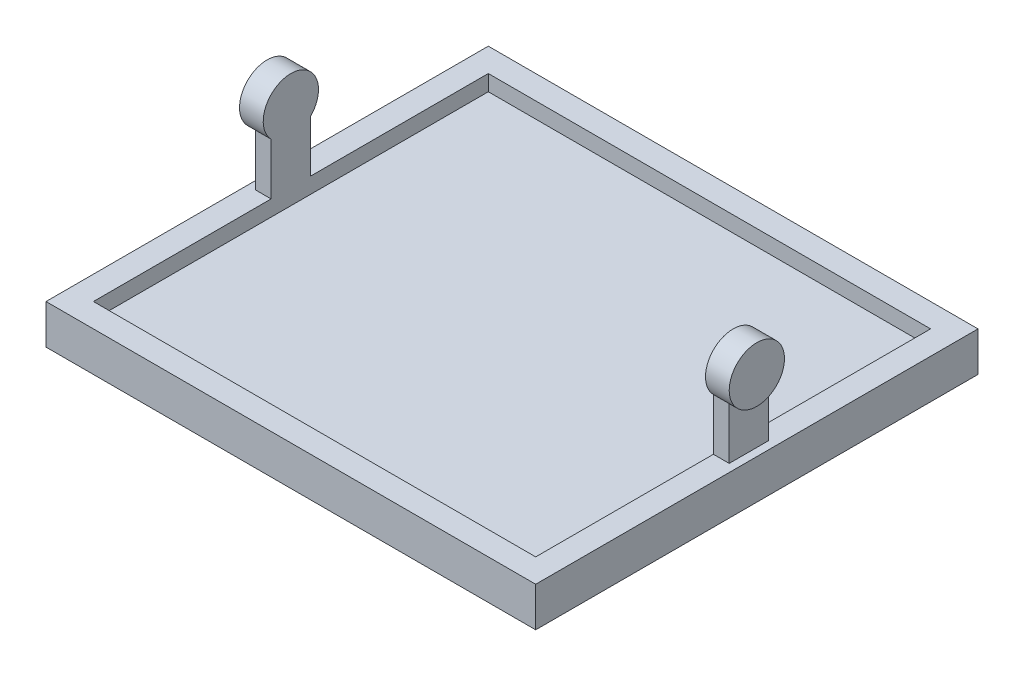
ISO-10303-21;
HEADER;
FILE_DESCRIPTION(('STEP AP214'),'2;1');
FILE_NAME('part.step','',(''),(''),'','','');
FILE_SCHEMA(('AUTOMOTIVE_DESIGN { 1 0 10303 214 1 1 1 1 }'));
ENDSEC;
DATA;
#1=APPLICATION_CONTEXT('core data for automotive mechanical design processes');
#2=APPLICATION_PROTOCOL_DEFINITION('international standard','automotive_design',2000,#1);
#3=PRODUCT_CONTEXT('',#1,'mechanical');
#4=PRODUCT('Part','Part','',(#3));
#5=PRODUCT_RELATED_PRODUCT_CATEGORY('part','',(#4));
#6=PRODUCT_DEFINITION_FORMATION('','',#4);
#7=PRODUCT_DEFINITION_CONTEXT('part definition',#1,'design');
#8=PRODUCT_DEFINITION('design','',#6,#7);
#9=PRODUCT_DEFINITION_SHAPE('','',#8);
#10=(LENGTH_UNIT() NAMED_UNIT(*) SI_UNIT(.MILLI.,.METRE.));
#11=(NAMED_UNIT(*) PLANE_ANGLE_UNIT() SI_UNIT($,.RADIAN.));
#12=(NAMED_UNIT(*) SI_UNIT($,.STERADIAN.) SOLID_ANGLE_UNIT());
#13=UNCERTAINTY_MEASURE_WITH_UNIT(LENGTH_MEASURE(1.E-05),#10,'distance_accuracy_value','');
#14=(GEOMETRIC_REPRESENTATION_CONTEXT(3) GLOBAL_UNCERTAINTY_ASSIGNED_CONTEXT((#13)) GLOBAL_UNIT_ASSIGNED_CONTEXT((#10,
#11,#12)) REPRESENTATION_CONTEXT('',''));
#15=CARTESIAN_POINT('',(0.,0.,0.));
#16=DIRECTION('',(0.,0.,1.));
#17=DIRECTION('',(1.,0.,0.));
#18=AXIS2_PLACEMENT_3D('',#15,#16,#17);
#19=CARTESIAN_POINT('',(0.,6.35,0.));
#20=DIRECTION('',(0.,1.,0.));
#21=DIRECTION('',(0.,0.,1.));
#22=AXIS2_PLACEMENT_3D('',#19,#20,#21);
#23=PLANE('',#22);
#24=DIRECTION('',(0.,0.,-1.));
#25=VECTOR('',#24,1.);
#26=CARTESIAN_POINT('',(39.37,6.35,-35.56));
#27=LINE('',#26,#25);
#28=CARTESIAN_POINT('',(39.37,6.35,35.56));
#29=VERTEX_POINT('',#28);
#30=CARTESIAN_POINT('',(39.37,6.35,-35.56));
#31=VERTEX_POINT('',#30);
#32=EDGE_CURVE('E239',#29,#31,#27,.T.);
#33=ORIENTED_EDGE('',*,*,#32,.T.);
#34=DIRECTION('',(-1.,0.,0.));
#35=VECTOR('',#34,1.);
#36=CARTESIAN_POINT('',(-39.37,6.35,-35.56));
#37=LINE('',#36,#35);
#38=CARTESIAN_POINT('',(-39.37,6.35,-35.56));
#39=VERTEX_POINT('',#38);
#40=EDGE_CURVE('E243',#31,#39,#37,.T.);
#41=ORIENTED_EDGE('',*,*,#40,.T.);
#42=DIRECTION('',(0.,0.,1.));
#43=VECTOR('',#42,1.);
#44=CARTESIAN_POINT('',(-39.37,6.35,-35.56));
#45=LINE('',#44,#43);
#46=CARTESIAN_POINT('',(-39.37,6.35,35.56));
#47=VERTEX_POINT('',#46);
#48=EDGE_CURVE('E247',#39,#47,#45,.T.);
#49=ORIENTED_EDGE('',*,*,#48,.T.);
#50=DIRECTION('',(1.,0.,0.));
#51=VECTOR('',#50,1.);
#52=CARTESIAN_POINT('',(-39.37,6.35,35.56));
#53=LINE('',#52,#51);
#54=EDGE_CURVE('E250',#47,#29,#53,.T.);
#55=ORIENTED_EDGE('',*,*,#54,.T.);
#56=EDGE_LOOP('',(#33,#41,#49,#55));
#57=FACE_BOUND('',#56,.T.);
#58=DIRECTION('',(0.,0.,-1.));
#59=VECTOR('',#58,1.);
#60=CARTESIAN_POINT('',(35.56,6.35,-31.75));
#61=LINE('',#60,#59);
#62=CARTESIAN_POINT('',(35.56,6.35,-3.175));
#63=VERTEX_POINT('',#62);
#64=CARTESIAN_POINT('',(35.56,6.35,-31.75));
#65=VERTEX_POINT('',#64);
#66=EDGE_CURVE('E170',#63,#65,#61,.T.);
#67=ORIENTED_EDGE('',*,*,#66,.F.);
#68=DIRECTION('',(-1.,0.,0.));
#69=VECTOR('',#68,1.);
#70=CARTESIAN_POINT('',(35.56,6.35,-3.175));
#71=LINE('',#70,#69);
#72=CARTESIAN_POINT('',(38.1,6.35,-3.175));
#73=VERTEX_POINT('',#72);
#74=EDGE_CURVE('E151',#73,#63,#71,.T.);
#75=ORIENTED_EDGE('',*,*,#74,.F.);
#76=DIRECTION('',(0.,0.,-1.));
#77=VECTOR('',#76,1.);
#78=CARTESIAN_POINT('',(38.1,6.35,-3.175));
#79=LINE('',#78,#77);
#80=CARTESIAN_POINT('',(38.1,6.35,3.175));
#81=VERTEX_POINT('',#80);
#82=EDGE_CURVE('E159',#81,#73,#79,.T.);
#83=ORIENTED_EDGE('',*,*,#82,.F.);
#84=DIRECTION('',(1.,0.,0.));
#85=VECTOR('',#84,1.);
#86=CARTESIAN_POINT('',(35.56,6.35,3.175));
#87=LINE('',#86,#85);
#88=CARTESIAN_POINT('',(35.56,6.35,3.175));
#89=VERTEX_POINT('',#88);
#90=EDGE_CURVE('E172',#89,#81,#87,.T.);
#91=ORIENTED_EDGE('',*,*,#90,.F.);
#92=CARTESIAN_POINT('',(35.56,6.35,31.75));
#93=VERTEX_POINT('',#92);
#94=EDGE_CURVE('E208',#93,#89,#61,.T.);
#95=ORIENTED_EDGE('',*,*,#94,.F.);
#96=DIRECTION('',(1.,0.,0.));
#97=VECTOR('',#96,1.);
#98=CARTESIAN_POINT('',(-35.56,6.35,31.75));
#99=LINE('',#98,#97);
#100=CARTESIAN_POINT('',(-35.56,6.35,31.75));
#101=VERTEX_POINT('',#100);
#102=EDGE_CURVE('E220',#101,#93,#99,.T.);
#103=ORIENTED_EDGE('',*,*,#102,.F.);
#104=DIRECTION('',(0.,0.,1.));
#105=VECTOR('',#104,1.);
#106=CARTESIAN_POINT('',(-35.56,6.35,-31.75));
#107=LINE('',#106,#105);
#108=CARTESIAN_POINT('',(-35.56,6.35,3.175));
#109=VERTEX_POINT('',#108);
#110=EDGE_CURVE('E215',#109,#101,#107,.T.);
#111=ORIENTED_EDGE('',*,*,#110,.F.);
#112=DIRECTION('',(1.,0.,0.));
#113=VECTOR('',#112,1.);
#114=CARTESIAN_POINT('',(-38.1,6.35,3.17499999999999));
#115=LINE('',#114,#113);
#116=CARTESIAN_POINT('',(-38.1,6.35,3.17499999999999));
#117=VERTEX_POINT('',#116);
#118=EDGE_CURVE('E192',#117,#109,#115,.T.);
#119=ORIENTED_EDGE('',*,*,#118,.F.);
#120=DIRECTION('',(0.,0.,1.));
#121=VECTOR('',#120,1.);
#122=CARTESIAN_POINT('',(-38.1,6.35,-3.17500000000001));
#123=LINE('',#122,#121);
#124=CARTESIAN_POINT('',(-38.1,6.35,-3.17500000000001));
#125=VERTEX_POINT('',#124);
#126=EDGE_CURVE('E188',#125,#117,#123,.T.);
#127=ORIENTED_EDGE('',*,*,#126,.F.);
#128=DIRECTION('',(-1.,0.,0.));
#129=VECTOR('',#128,1.);
#130=CARTESIAN_POINT('',(-38.1,6.35,-3.17500000000001));
#131=LINE('',#130,#129);
#132=CARTESIAN_POINT('',(-35.56,6.35,-3.175));
#133=VERTEX_POINT('',#132);
#134=EDGE_CURVE('E156',#133,#125,#131,.T.);
#135=ORIENTED_EDGE('',*,*,#134,.F.);
#136=CARTESIAN_POINT('',(-35.56,6.35,-31.75));
#137=VERTEX_POINT('',#136);
#138=EDGE_CURVE('E216',#137,#133,#107,.T.);
#139=ORIENTED_EDGE('',*,*,#138,.F.);
#140=DIRECTION('',(-1.,0.,0.));
#141=VECTOR('',#140,1.);
#142=CARTESIAN_POINT('',(-35.56,6.35,-31.75));
#143=LINE('',#142,#141);
#144=EDGE_CURVE('E212',#65,#137,#143,.T.);
#145=ORIENTED_EDGE('',*,*,#144,.F.);
#146=EDGE_LOOP('',(#67,#75,#83,#91,#95,#103,#111,#119,#127,#135,#139,#145));
#147=FACE_BOUND('',#146,.T.);
#148=ADVANCED_FACE('F39',(#57,#147),#23,.T.);
#149=CARTESIAN_POINT('',(0.,3.81,0.));
#150=DIRECTION('',(0.,-1.,0.));
#151=DIRECTION('',(0.,0.,-1.));
#152=AXIS2_PLACEMENT_3D('',#149,#150,#151);
#153=PLANE('',#152);
#154=DIRECTION('',(1.,0.,0.));
#155=VECTOR('',#154,1.);
#156=CARTESIAN_POINT('',(-35.56,3.81,31.75));
#157=LINE('',#156,#155);
#158=CARTESIAN_POINT('',(-35.56,3.81,31.75));
#159=VERTEX_POINT('',#158);
#160=CARTESIAN_POINT('',(35.56,3.81,31.75));
#161=VERTEX_POINT('',#160);
#162=EDGE_CURVE('E280',#159,#161,#157,.T.);
#163=ORIENTED_EDGE('',*,*,#162,.T.);
#164=DIRECTION('',(0.,0.,1.));
#165=VECTOR('',#164,1.);
#166=CARTESIAN_POINT('',(35.56,3.81,-31.75));
#167=LINE('',#166,#165);
#168=CARTESIAN_POINT('',(35.56,3.81,-31.75));
#169=VERTEX_POINT('',#168);
#170=EDGE_CURVE('E284',#169,#161,#167,.T.);
#171=ORIENTED_EDGE('',*,*,#170,.F.);
#172=DIRECTION('',(1.,0.,0.));
#173=VECTOR('',#172,1.);
#174=CARTESIAN_POINT('',(-35.56,3.81,-31.75));
#175=LINE('',#174,#173);
#176=CARTESIAN_POINT('',(-35.56,3.81,-31.75));
#177=VERTEX_POINT('',#176);
#178=EDGE_CURVE('E288',#177,#169,#175,.T.);
#179=ORIENTED_EDGE('',*,*,#178,.F.);
#180=DIRECTION('',(0.,0.,1.));
#181=VECTOR('',#180,1.);
#182=CARTESIAN_POINT('',(-35.56,3.81,-31.75));
#183=LINE('',#182,#181);
#184=EDGE_CURVE('E291',#177,#159,#183,.T.);
#185=ORIENTED_EDGE('',*,*,#184,.T.);
#186=EDGE_LOOP('',(#163,#171,#179,#185));
#187=FACE_BOUND('',#186,.T.);
#188=ADVANCED_FACE('F348',(#187),#153,.F.);
#189=CARTESIAN_POINT('',(35.56,6.35,-31.75));
#190=DIRECTION('',(-1.,0.,0.));
#191=DIRECTION('',(0.,0.,1.));
#192=AXIS2_PLACEMENT_3D('',#189,#190,#191);
#193=PLANE('',#192);
#194=DIRECTION('',(0.,-1.,0.));
#195=VECTOR('',#194,1.);
#196=CARTESIAN_POINT('',(35.56,17.78,3.175));
#197=LINE('',#196,#195);
#198=CARTESIAN_POINT('',(35.56,14.6691480266654,3.175));
#199=VERTEX_POINT('',#198);
#200=EDGE_CURVE('E180',#199,#89,#197,.T.);
#201=ORIENTED_EDGE('',*,*,#200,.F.);
#202=CARTESIAN_POINT('',(35.56,17.78,0.));
#203=DIRECTION('',(-1.,0.,0.));
#204=DIRECTION('',(0.,0.,1.));
#205=AXIS2_PLACEMENT_3D('',#202,#203,#204);
#206=CIRCLE('',#205,4.445);
#207=CARTESIAN_POINT('',(35.56,14.6691480266654,-3.175));
#208=VERTEX_POINT('',#207);
#209=EDGE_CURVE('E328',#199,#208,#206,.T.);
#210=ORIENTED_EDGE('',*,*,#209,.T.);
#211=DIRECTION('',(0.,-1.,0.));
#212=VECTOR('',#211,1.);
#213=CARTESIAN_POINT('',(35.56,17.78,-3.175));
#214=LINE('',#213,#212);
#215=EDGE_CURVE('E60',#208,#63,#214,.T.);
#216=ORIENTED_EDGE('',*,*,#215,.T.);
#217=ORIENTED_EDGE('',*,*,#66,.T.);
#218=DIRECTION('',(0.,-1.,0.));
#219=VECTOR('',#218,1.);
#220=CARTESIAN_POINT('',(35.56,6.35,-31.75));
#221=LINE('',#220,#219);
#222=EDGE_CURVE('E234',#65,#169,#221,.T.);
#223=ORIENTED_EDGE('',*,*,#222,.T.);
#224=ORIENTED_EDGE('',*,*,#170,.T.);
#225=DIRECTION('',(0.,-1.,0.));
#226=VECTOR('',#225,1.);
#227=CARTESIAN_POINT('',(35.56,6.35,31.75));
#228=LINE('',#227,#226);
#229=EDGE_CURVE('E223',#93,#161,#228,.T.);
#230=ORIENTED_EDGE('',*,*,#229,.F.);
#231=ORIENTED_EDGE('',*,*,#94,.T.);
#232=EDGE_LOOP('',(#201,#210,#216,#217,#223,#224,#230,#231));
#233=FACE_BOUND('',#232,.T.);
#234=ADVANCED_FACE('F356',(#233),#193,.T.);
#235=CARTESIAN_POINT('',(-35.56,6.35,-31.75));
#236=DIRECTION('',(0.,0.,1.));
#237=DIRECTION('',(1.,0.,0.));
#238=AXIS2_PLACEMENT_3D('',#235,#236,#237);
#239=PLANE('',#238);
#240=ORIENTED_EDGE('',*,*,#178,.T.);
#241=ORIENTED_EDGE('',*,*,#222,.F.);
#242=ORIENTED_EDGE('',*,*,#144,.T.);
#243=DIRECTION('',(0.,-1.,0.));
#244=VECTOR('',#243,1.);
#245=CARTESIAN_POINT('',(-35.56,6.35,-31.75));
#246=LINE('',#245,#244);
#247=EDGE_CURVE('E230',#137,#177,#246,.T.);
#248=ORIENTED_EDGE('',*,*,#247,.T.);
#249=EDGE_LOOP('',(#240,#241,#242,#248));
#250=FACE_BOUND('',#249,.T.);
#251=ADVANCED_FACE('F408',(#250),#239,.T.);
#252=CARTESIAN_POINT('',(-35.56,6.35,-31.75));
#253=DIRECTION('',(1.,0.,0.));
#254=DIRECTION('',(0.,0.,-1.));
#255=AXIS2_PLACEMENT_3D('',#252,#253,#254);
#256=PLANE('',#255);
#257=DIRECTION('',(0.,-1.,0.));
#258=VECTOR('',#257,1.);
#259=CARTESIAN_POINT('',(-35.56,17.78,-3.17500000000001));
#260=LINE('',#259,#258);
#261=CARTESIAN_POINT('',(-35.56,14.6691480266654,-3.17500000000001));
#262=VERTEX_POINT('',#261);
#263=EDGE_CURVE('E205',#262,#133,#260,.T.);
#264=ORIENTED_EDGE('',*,*,#263,.F.);
#265=CARTESIAN_POINT('',(-35.56,17.78,0.));
#266=DIRECTION('',(1.,0.,0.));
#267=DIRECTION('',(0.,0.,-1.));
#268=AXIS2_PLACEMENT_3D('',#265,#266,#267);
#269=CIRCLE('',#268,4.445);
#270=CARTESIAN_POINT('',(-35.56,14.6691480266654,3.17499999999999));
#271=VERTEX_POINT('',#270);
#272=EDGE_CURVE('E317',#262,#271,#269,.T.);
#273=ORIENTED_EDGE('',*,*,#272,.T.);
#274=DIRECTION('',(0.,-1.,0.));
#275=VECTOR('',#274,1.);
#276=CARTESIAN_POINT('',(-35.56,17.78,3.17499999999999));
#277=LINE('',#276,#275);
#278=EDGE_CURVE('E196',#271,#109,#277,.T.);
#279=ORIENTED_EDGE('',*,*,#278,.T.);
#280=ORIENTED_EDGE('',*,*,#110,.T.);
#281=DIRECTION('',(0.,-1.,0.));
#282=VECTOR('',#281,1.);
#283=CARTESIAN_POINT('',(-35.56,6.35,31.75));
#284=LINE('',#283,#282);
#285=EDGE_CURVE('E226',#101,#159,#284,.T.);
#286=ORIENTED_EDGE('',*,*,#285,.T.);
#287=ORIENTED_EDGE('',*,*,#184,.F.);
#288=ORIENTED_EDGE('',*,*,#247,.F.);
#289=ORIENTED_EDGE('',*,*,#138,.T.);
#290=EDGE_LOOP('',(#264,#273,#279,#280,#286,#287,#288,#289));
#291=FACE_BOUND('',#290,.T.);
#292=ADVANCED_FACE('F380',(#291),#256,.T.);
#293=CARTESIAN_POINT('',(-35.56,6.35,31.75));
#294=DIRECTION('',(0.,0.,-1.));
#295=DIRECTION('',(-1.,0.,0.));
#296=AXIS2_PLACEMENT_3D('',#293,#294,#295);
#297=PLANE('',#296);
#298=ORIENTED_EDGE('',*,*,#162,.F.);
#299=ORIENTED_EDGE('',*,*,#285,.F.);
#300=ORIENTED_EDGE('',*,*,#102,.T.);
#301=ORIENTED_EDGE('',*,*,#229,.T.);
#302=EDGE_LOOP('',(#298,#299,#300,#301));
#303=FACE_BOUND('',#302,.T.);
#304=ADVANCED_FACE('F375',(#303),#297,.T.);
#305=CARTESIAN_POINT('',(39.37,6.35,-35.56));
#306=DIRECTION('',(-1.,0.,0.));
#307=DIRECTION('',(0.,0.,1.));
#308=AXIS2_PLACEMENT_3D('',#305,#306,#307);
#309=PLANE('',#308);
#310=DIRECTION('',(0.,0.,-1.));
#311=VECTOR('',#310,1.);
#312=CARTESIAN_POINT('',(39.37,0.,-35.56));
#313=LINE('',#312,#311);
#314=CARTESIAN_POINT('',(39.37,0.,35.56));
#315=VERTEX_POINT('',#314);
#316=CARTESIAN_POINT('',(39.37,0.,-35.56));
#317=VERTEX_POINT('',#316);
#318=EDGE_CURVE('E238',#315,#317,#313,.T.);
#319=ORIENTED_EDGE('',*,*,#318,.T.);
#320=DIRECTION('',(0.,-1.,0.));
#321=VECTOR('',#320,1.);
#322=CARTESIAN_POINT('',(39.37,6.35,-35.56));
#323=LINE('',#322,#321);
#324=EDGE_CURVE('E276',#31,#317,#323,.T.);
#325=ORIENTED_EDGE('',*,*,#324,.F.);
#326=ORIENTED_EDGE('',*,*,#32,.F.);
#327=DIRECTION('',(0.,-1.,0.));
#328=VECTOR('',#327,1.);
#329=CARTESIAN_POINT('',(39.37,6.35,35.56));
#330=LINE('',#329,#328);
#331=EDGE_CURVE('E253',#29,#315,#330,.T.);
#332=ORIENTED_EDGE('',*,*,#331,.T.);
#333=EDGE_LOOP('',(#319,#325,#326,#332));
#334=FACE_BOUND('',#333,.T.);
#335=ADVANCED_FACE('F372',(#334),#309,.F.);
#336=CARTESIAN_POINT('',(-39.37,6.35,-35.56));
#337=DIRECTION('',(0.,0.,1.));
#338=DIRECTION('',(1.,0.,0.));
#339=AXIS2_PLACEMENT_3D('',#336,#337,#338);
#340=PLANE('',#339);
#341=DIRECTION('',(-1.,0.,0.));
#342=VECTOR('',#341,1.);
#343=CARTESIAN_POINT('',(-39.37,0.,-35.56));
#344=LINE('',#343,#342);
#345=CARTESIAN_POINT('',(-39.37,0.,-35.56));
#346=VERTEX_POINT('',#345);
#347=EDGE_CURVE('E257',#317,#346,#344,.T.);
#348=ORIENTED_EDGE('',*,*,#347,.T.);
#349=DIRECTION('',(0.,-1.,0.));
#350=VECTOR('',#349,1.);
#351=CARTESIAN_POINT('',(-39.37,6.35,-35.56));
#352=LINE('',#351,#350);
#353=EDGE_CURVE('E272',#39,#346,#352,.T.);
#354=ORIENTED_EDGE('',*,*,#353,.F.);
#355=ORIENTED_EDGE('',*,*,#40,.F.);
#356=ORIENTED_EDGE('',*,*,#324,.T.);
#357=EDGE_LOOP('',(#348,#354,#355,#356));
#358=FACE_BOUND('',#357,.T.);
#359=ADVANCED_FACE('F368',(#358),#340,.F.);
#360=CARTESIAN_POINT('',(-39.37,6.35,-35.56));
#361=DIRECTION('',(1.,0.,0.));
#362=DIRECTION('',(0.,0.,-1.));
#363=AXIS2_PLACEMENT_3D('',#360,#361,#362);
#364=PLANE('',#363);
#365=DIRECTION('',(0.,0.,1.));
#366=VECTOR('',#365,1.);
#367=CARTESIAN_POINT('',(-39.37,0.,-35.56));
#368=LINE('',#367,#366);
#369=CARTESIAN_POINT('',(-39.37,0.,35.56));
#370=VERTEX_POINT('',#369);
#371=EDGE_CURVE('E260',#346,#370,#368,.T.);
#372=ORIENTED_EDGE('',*,*,#371,.T.);
#373=DIRECTION('',(0.,-1.,0.));
#374=VECTOR('',#373,1.);
#375=CARTESIAN_POINT('',(-39.37,6.35,35.56));
#376=LINE('',#375,#374);
#377=EDGE_CURVE('E268',#47,#370,#376,.T.);
#378=ORIENTED_EDGE('',*,*,#377,.F.);
#379=ORIENTED_EDGE('',*,*,#48,.F.);
#380=ORIENTED_EDGE('',*,*,#353,.T.);
#381=EDGE_LOOP('',(#372,#378,#379,#380));
#382=FACE_BOUND('',#381,.T.);
#383=ADVANCED_FACE('F364',(#382),#364,.F.);
#384=CARTESIAN_POINT('',(-39.37,6.35,35.56));
#385=DIRECTION('',(0.,0.,-1.));
#386=DIRECTION('',(-1.,0.,0.));
#387=AXIS2_PLACEMENT_3D('',#384,#385,#386);
#388=PLANE('',#387);
#389=DIRECTION('',(1.,0.,0.));
#390=VECTOR('',#389,1.);
#391=CARTESIAN_POINT('',(-39.37,0.,35.56));
#392=LINE('',#391,#390);
#393=EDGE_CURVE('E244',#370,#315,#392,.T.);
#394=ORIENTED_EDGE('',*,*,#393,.T.);
#395=ORIENTED_EDGE('',*,*,#331,.F.);
#396=ORIENTED_EDGE('',*,*,#54,.F.);
#397=ORIENTED_EDGE('',*,*,#377,.T.);
#398=EDGE_LOOP('',(#394,#395,#396,#397));
#399=FACE_BOUND('',#398,.T.);
#400=ADVANCED_FACE('F361',(#399),#388,.F.);
#401=CARTESIAN_POINT('',(0.,0.,0.));
#402=DIRECTION('',(0.,-1.,0.));
#403=DIRECTION('',(0.,0.,-1.));
#404=AXIS2_PLACEMENT_3D('',#401,#402,#403);
#405=PLANE('',#404);
#406=ORIENTED_EDGE('',*,*,#318,.F.);
#407=ORIENTED_EDGE('',*,*,#393,.F.);
#408=ORIENTED_EDGE('',*,*,#371,.F.);
#409=ORIENTED_EDGE('',*,*,#347,.F.);
#410=EDGE_LOOP('',(#406,#407,#408,#409));
#411=FACE_BOUND('',#410,.T.);
#412=ADVANCED_FACE('F41',(#411),#405,.T.);
#413=CARTESIAN_POINT('',(-38.1,17.78,-3.17500000000001));
#414=DIRECTION('',(0.,0.,1.));
#415=DIRECTION('',(1.,0.,0.));
#416=AXIS2_PLACEMENT_3D('',#413,#414,#415);
#417=PLANE('',#416);
#418=DIRECTION('',(0.,-1.,0.));
#419=VECTOR('',#418,1.);
#420=CARTESIAN_POINT('',(-38.1,17.78,-3.17500000000001));
#421=LINE('',#420,#419);
#422=CARTESIAN_POINT('',(-38.1,14.6691480266654,-3.17500000000001));
#423=VERTEX_POINT('',#422);
#424=EDGE_CURVE('E202',#423,#125,#421,.T.);
#425=ORIENTED_EDGE('',*,*,#424,.F.);
#426=DIRECTION('',(1.,0.,0.));
#427=VECTOR('',#426,1.);
#428=CARTESIAN_POINT('',(-39.37,14.6691480266654,-3.17500000000001));
#429=LINE('',#428,#427);
#430=EDGE_CURVE('E167',#423,#262,#429,.T.);
#431=ORIENTED_EDGE('',*,*,#430,.T.);
#432=ORIENTED_EDGE('',*,*,#263,.T.);
#433=ORIENTED_EDGE('',*,*,#134,.T.);
#434=EDGE_LOOP('',(#425,#431,#432,#433));
#435=FACE_BOUND('',#434,.T.);
#436=ADVANCED_FACE('F395',(#435),#417,.F.);
#437=CARTESIAN_POINT('',(-38.1,17.78,-3.17500000000001));
#438=DIRECTION('',(1.,0.,0.));
#439=DIRECTION('',(0.,0.,-1.));
#440=AXIS2_PLACEMENT_3D('',#437,#438,#439);
#441=PLANE('',#440);
#442=DIRECTION('',(0.,-1.,0.));
#443=VECTOR('',#442,1.);
#444=CARTESIAN_POINT('',(-38.1,17.78,3.17499999999999));
#445=LINE('',#444,#443);
#446=CARTESIAN_POINT('',(-38.1,14.6691480266654,3.17499999999999));
#447=VERTEX_POINT('',#446);
#448=EDGE_CURVE('E199',#447,#117,#445,.T.);
#449=ORIENTED_EDGE('',*,*,#448,.F.);
#450=CARTESIAN_POINT('',(-38.1,17.78,0.));
#451=DIRECTION('',(1.,0.,0.));
#452=DIRECTION('',(0.,0.,-1.));
#453=AXIS2_PLACEMENT_3D('',#450,#451,#452);
#454=CIRCLE('',#453,4.445);
#455=EDGE_CURVE('E306',#447,#423,#454,.T.);
#456=ORIENTED_EDGE('',*,*,#455,.T.);
#457=ORIENTED_EDGE('',*,*,#424,.T.);
#458=ORIENTED_EDGE('',*,*,#126,.T.);
#459=EDGE_LOOP('',(#449,#456,#457,#458));
#460=FACE_BOUND('',#459,.T.);
#461=ADVANCED_FACE('F305',(#460),#441,.F.);
#462=CARTESIAN_POINT('',(-38.1,17.78,3.17499999999999));
#463=DIRECTION('',(0.,0.,-1.));
#464=DIRECTION('',(-1.,0.,0.));
#465=AXIS2_PLACEMENT_3D('',#462,#463,#464);
#466=PLANE('',#465);
#467=ORIENTED_EDGE('',*,*,#278,.F.);
#468=DIRECTION('',(1.,0.,0.));
#469=VECTOR('',#468,1.);
#470=CARTESIAN_POINT('',(-39.37,14.6691480266654,3.17499999999999));
#471=LINE('',#470,#469);
#472=EDGE_CURVE('E48',#271,#447,#471,.F.);
#473=ORIENTED_EDGE('',*,*,#472,.T.);
#474=ORIENTED_EDGE('',*,*,#448,.T.);
#475=ORIENTED_EDGE('',*,*,#118,.T.);
#476=EDGE_LOOP('',(#467,#473,#474,#475));
#477=FACE_BOUND('',#476,.T.);
#478=ADVANCED_FACE('F298',(#477),#466,.F.);
#479=CARTESIAN_POINT('',(38.1,17.78,-3.175));
#480=DIRECTION('',(-1.,0.,0.));
#481=DIRECTION('',(0.,0.,1.));
#482=AXIS2_PLACEMENT_3D('',#479,#480,#481);
#483=PLANE('',#482);
#484=DIRECTION('',(0.,-1.,0.));
#485=VECTOR('',#484,1.);
#486=CARTESIAN_POINT('',(38.1,17.78,-3.175));
#487=LINE('',#486,#485);
#488=CARTESIAN_POINT('',(38.1,14.6691480266654,-3.175));
#489=VERTEX_POINT('',#488);
#490=EDGE_CURVE('E147',#489,#73,#487,.T.);
#491=ORIENTED_EDGE('',*,*,#490,.F.);
#492=CARTESIAN_POINT('',(38.1,17.78,0.));
#493=DIRECTION('',(-1.,0.,0.));
#494=DIRECTION('',(0.,0.,1.));
#495=AXIS2_PLACEMENT_3D('',#492,#493,#494);
#496=CIRCLE('',#495,4.445);
#497=CARTESIAN_POINT('',(38.1,14.6691480266654,3.175));
#498=VERTEX_POINT('',#497);
#499=EDGE_CURVE('E324',#489,#498,#496,.T.);
#500=ORIENTED_EDGE('',*,*,#499,.T.);
#501=DIRECTION('',(0.,-1.,0.));
#502=VECTOR('',#501,1.);
#503=CARTESIAN_POINT('',(38.1,17.78,3.175));
#504=LINE('',#503,#502);
#505=EDGE_CURVE('E162',#498,#81,#504,.T.);
#506=ORIENTED_EDGE('',*,*,#505,.T.);
#507=ORIENTED_EDGE('',*,*,#82,.T.);
#508=EDGE_LOOP('',(#491,#500,#506,#507));
#509=FACE_BOUND('',#508,.T.);
#510=ADVANCED_FACE('F160',(#509),#483,.F.);
#511=CARTESIAN_POINT('',(35.56,17.78,-3.175));
#512=DIRECTION('',(0.,0.,1.));
#513=DIRECTION('',(1.,0.,0.));
#514=AXIS2_PLACEMENT_3D('',#511,#512,#513);
#515=PLANE('',#514);
#516=ORIENTED_EDGE('',*,*,#215,.F.);
#517=DIRECTION('',(-1.,0.,0.));
#518=VECTOR('',#517,1.);
#519=CARTESIAN_POINT('',(39.37,14.6691480266654,-3.175));
#520=LINE('',#519,#518);
#521=EDGE_CURVE('E55',#208,#489,#520,.F.);
#522=ORIENTED_EDGE('',*,*,#521,.T.);
#523=ORIENTED_EDGE('',*,*,#490,.T.);
#524=ORIENTED_EDGE('',*,*,#74,.T.);
#525=EDGE_LOOP('',(#516,#522,#523,#524));
#526=FACE_BOUND('',#525,.T.);
#527=ADVANCED_FACE('F149',(#526),#515,.F.);
#528=CARTESIAN_POINT('',(35.56,17.78,3.175));
#529=DIRECTION('',(0.,0.,-1.));
#530=DIRECTION('',(-1.,0.,0.));
#531=AXIS2_PLACEMENT_3D('',#528,#529,#530);
#532=PLANE('',#531);
#533=ORIENTED_EDGE('',*,*,#505,.F.);
#534=DIRECTION('',(-1.,0.,0.));
#535=VECTOR('',#534,1.);
#536=CARTESIAN_POINT('',(39.37,14.6691480266654,3.175));
#537=LINE('',#536,#535);
#538=EDGE_CURVE('E11',#498,#199,#537,.T.);
#539=ORIENTED_EDGE('',*,*,#538,.T.);
#540=ORIENTED_EDGE('',*,*,#200,.T.);
#541=ORIENTED_EDGE('',*,*,#90,.T.);
#542=EDGE_LOOP('',(#533,#539,#540,#541));
#543=FACE_BOUND('',#542,.T.);
#544=ADVANCED_FACE('F432',(#543),#532,.F.);
#545=CARTESIAN_POINT('',(-39.37,17.78,0.));
#546=DIRECTION('',(1.,0.,0.));
#547=DIRECTION('',(0.,0.,-1.));
#548=AXIS2_PLACEMENT_3D('',#545,#546,#547);
#549=CYLINDRICAL_SURFACE('',#548,4.445);
#550=CARTESIAN_POINT('',(-39.37,17.78,0.));
#551=DIRECTION('',(1.,0.,0.));
#552=DIRECTION('',(0.,0.,-1.));
#553=AXIS2_PLACEMENT_3D('',#550,#551,#552);
#554=CIRCLE('',#553,4.445);
#555=CARTESIAN_POINT('',(-39.37,17.78,-4.445));
#556=VERTEX_POINT('',#555);
#557=EDGE_CURVE('E312',#556,#556,#554,.T.);
#558=ORIENTED_EDGE('',*,*,#557,.T.);
#559=EDGE_LOOP('',(#558));
#560=FACE_BOUND('',#559,.T.);
#561=ORIENTED_EDGE('',*,*,#430,.F.);
#562=ORIENTED_EDGE('',*,*,#455,.F.);
#563=ORIENTED_EDGE('',*,*,#472,.F.);
#564=ORIENTED_EDGE('',*,*,#272,.F.);
#565=EDGE_LOOP('',(#561,#562,#563,#564));
#566=FACE_BOUND('',#565,.T.);
#567=ADVANCED_FACE('F310',(#560,#566),#549,.T.);
#568=CARTESIAN_POINT('',(-39.37,17.78,0.));
#569=DIRECTION('',(1.,0.,0.));
#570=DIRECTION('',(0.,0.,-1.));
#571=AXIS2_PLACEMENT_3D('',#568,#569,#570);
#572=PLANE('',#571);
#573=ORIENTED_EDGE('',*,*,#557,.F.);
#574=EDGE_LOOP('',(#573));
#575=FACE_BOUND('',#574,.T.);
#576=ADVANCED_FACE('F345',(#575),#572,.F.);
#577=CARTESIAN_POINT('',(39.37,17.78,0.));
#578=DIRECTION('',(-1.,0.,0.));
#579=DIRECTION('',(0.,0.,1.));
#580=AXIS2_PLACEMENT_3D('',#577,#578,#579);
#581=CYLINDRICAL_SURFACE('',#580,4.445);
#582=CARTESIAN_POINT('',(39.37,17.78,0.));
#583=DIRECTION('',(-1.,0.,0.));
#584=DIRECTION('',(0.,0.,1.));
#585=AXIS2_PLACEMENT_3D('',#582,#583,#584);
#586=CIRCLE('',#585,4.445);
#587=CARTESIAN_POINT('',(39.37,17.78,4.44499999999999));
#588=VERTEX_POINT('',#587);
#589=EDGE_CURVE('E327',#588,#588,#586,.T.);
#590=ORIENTED_EDGE('',*,*,#589,.T.);
#591=EDGE_LOOP('',(#590));
#592=FACE_BOUND('',#591,.T.);
#593=ORIENTED_EDGE('',*,*,#521,.F.);
#594=ORIENTED_EDGE('',*,*,#209,.F.);
#595=ORIENTED_EDGE('',*,*,#538,.F.);
#596=ORIENTED_EDGE('',*,*,#499,.F.);
#597=EDGE_LOOP('',(#593,#594,#595,#596));
#598=FACE_BOUND('',#597,.T.);
#599=ADVANCED_FACE('F336',(#592,#598),#581,.T.);
#600=CARTESIAN_POINT('',(39.37,17.78,0.));
#601=DIRECTION('',(-1.,0.,0.));
#602=DIRECTION('',(0.,0.,1.));
#603=AXIS2_PLACEMENT_3D('',#600,#601,#602);
#604=PLANE('',#603);
#605=ORIENTED_EDGE('',*,*,#589,.F.);
#606=EDGE_LOOP('',(#605));
#607=FACE_BOUND('',#606,.T.);
#608=ADVANCED_FACE('F339',(#607),#604,.F.);
#609=CLOSED_SHELL('',(#148,#188,#234,#251,#292,#304,#335,#359,#383,#400,#412,#436,#461,#478,
#510,#527,#544,#567,#576,#599,#608));
#610=MANIFOLD_SOLID_BREP('B2',#609);
#611=ADVANCED_BREP_SHAPE_REPRESENTATION('',(#18,#610),#14);
#612=SHAPE_DEFINITION_REPRESENTATION(#9,#611);
ENDSEC;
END-ISO-10303-21;
